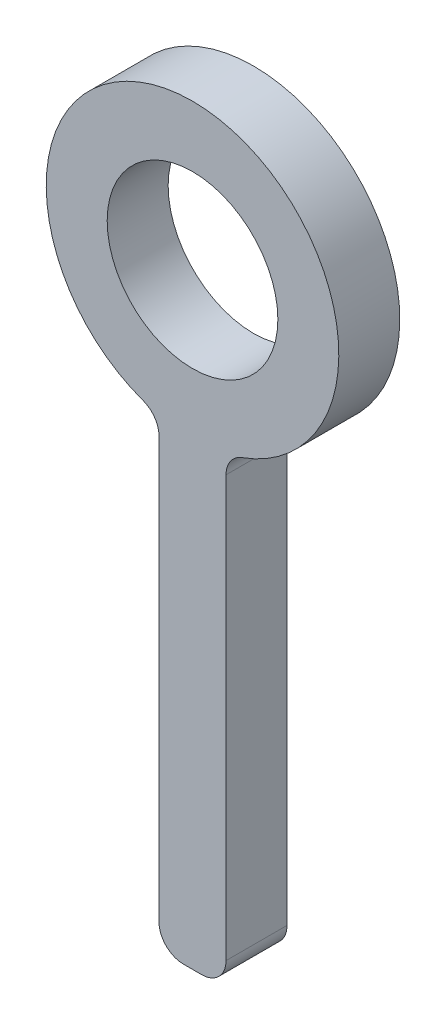
ISO-10303-21;
HEADER;
FILE_DESCRIPTION(('STEP AP214'),'2;1');
FILE_NAME('part.step','',(''),(''),'','','');
FILE_SCHEMA(('AUTOMOTIVE_DESIGN { 1 0 10303 214 1 1 1 1 }'));
ENDSEC;
DATA;
#1=APPLICATION_CONTEXT('core data for automotive mechanical design processes');
#2=APPLICATION_PROTOCOL_DEFINITION('international standard','automotive_design',2000,#1);
#3=PRODUCT_CONTEXT('',#1,'mechanical');
#4=PRODUCT('Part','Part','',(#3));
#5=PRODUCT_RELATED_PRODUCT_CATEGORY('part','',(#4));
#6=PRODUCT_DEFINITION_FORMATION('','',#4);
#7=PRODUCT_DEFINITION_CONTEXT('part definition',#1,'design');
#8=PRODUCT_DEFINITION('design','',#6,#7);
#9=PRODUCT_DEFINITION_SHAPE('','',#8);
#10=(LENGTH_UNIT() NAMED_UNIT(*) SI_UNIT(.MILLI.,.METRE.));
#11=(NAMED_UNIT(*) PLANE_ANGLE_UNIT() SI_UNIT($,.RADIAN.));
#12=(NAMED_UNIT(*) SI_UNIT($,.STERADIAN.) SOLID_ANGLE_UNIT());
#13=UNCERTAINTY_MEASURE_WITH_UNIT(LENGTH_MEASURE(1.E-05),#10,'distance_accuracy_value','');
#14=(GEOMETRIC_REPRESENTATION_CONTEXT(3) GLOBAL_UNCERTAINTY_ASSIGNED_CONTEXT((#13)) GLOBAL_UNIT_ASSIGNED_CONTEXT((#10,
#11,#12)) REPRESENTATION_CONTEXT('',''));
#15=CARTESIAN_POINT('',(0.,0.,0.));
#16=DIRECTION('',(0.,0.,1.));
#17=DIRECTION('',(1.,0.,0.));
#18=AXIS2_PLACEMENT_3D('',#15,#16,#17);
#19=CARTESIAN_POINT('',(2.75,11.6806463862237,5.));
#20=DIRECTION('',(0.,0.,-1.));
#21=DIRECTION('',(-1.,0.,0.));
#22=AXIS2_PLACEMENT_3D('',#19,#20,#21);
#23=PLANE('',#22);
#24=DIRECTION('',(1.,0.,0.));
#25=VECTOR('',#24,1.);
#26=CARTESIAN_POINT('',(0.,-38.,5.));
#27=LINE('',#26,#25);
#28=CARTESIAN_POINT('',(2.,-38.,5.));
#29=VERTEX_POINT('',#28);
#30=CARTESIAN_POINT('',(3.5,-38.,5.));
#31=VERTEX_POINT('',#30);
#32=EDGE_CURVE('E168',#29,#31,#27,.T.);
#33=ORIENTED_EDGE('',*,*,#32,.T.);
#34=CARTESIAN_POINT('',(3.5,-36.,5.));
#35=DIRECTION('',(0.,0.,-1.));
#36=DIRECTION('',(-1.,0.,0.));
#37=AXIS2_PLACEMENT_3D('',#34,#35,#36);
#38=CIRCLE('',#37,2.);
#39=CARTESIAN_POINT('',(5.5,-36.,5.));
#40=VERTEX_POINT('',#39);
#41=EDGE_CURVE('E140',#31,#40,#38,.F.);
#42=ORIENTED_EDGE('',*,*,#41,.T.);
#43=DIRECTION('',(0.,1.,0.));
#44=VECTOR('',#43,1.);
#45=CARTESIAN_POINT('',(5.5,-38.,5.));
#46=LINE('',#45,#44);
#47=CARTESIAN_POINT('',(5.5,-1.48892080484226,5.));
#48=VERTEX_POINT('',#47);
#49=EDGE_CURVE('E118',#40,#48,#46,.T.);
#50=ORIENTED_EDGE('',*,*,#49,.T.);
#51=CARTESIAN_POINT('',(7.50000000000001,-1.48892080484226,5.));
#52=DIRECTION('',(0.,0.,-1.));
#53=DIRECTION('',(-1.,0.,0.));
#54=AXIS2_PLACEMENT_3D('',#51,#52,#53);
#55=CIRCLE('',#54,2.);
#56=CARTESIAN_POINT('',(6.82142857142858,0.392445936738591,5.));
#57=VERTEX_POINT('',#56);
#58=EDGE_CURVE('E11',#48,#57,#55,.T.);
#59=ORIENTED_EDGE('',*,*,#58,.T.);
#60=CARTESIAN_POINT('',(2.75,11.6806463862237,5.));
#61=DIRECTION('',(0.,0.,1.));
#62=DIRECTION('',(-1.,0.,0.));
#63=AXIS2_PLACEMENT_3D('',#60,#61,#62);
#64=CIRCLE('',#63,12.);
#65=CARTESIAN_POINT('',(-1.32142857142857,0.392445936738591,5.));
#66=VERTEX_POINT('',#65);
#67=EDGE_CURVE('E124',#57,#66,#64,.T.);
#68=ORIENTED_EDGE('',*,*,#67,.T.);
#69=CARTESIAN_POINT('',(-2.,-1.48892080484226,5.));
#70=DIRECTION('',(0.,0.,-1.));
#71=DIRECTION('',(-1.,0.,0.));
#72=AXIS2_PLACEMENT_3D('',#69,#70,#71);
#73=CIRCLE('',#72,2.);
#74=CARTESIAN_POINT('',(0.,-1.48892080484226,5.));
#75=VERTEX_POINT('',#74);
#76=EDGE_CURVE('E54',#66,#75,#73,.T.);
#77=ORIENTED_EDGE('',*,*,#76,.T.);
#78=DIRECTION('',(0.,-1.,0.));
#79=VECTOR('',#78,1.);
#80=CARTESIAN_POINT('',(0.,0.,5.));
#81=LINE('',#80,#79);
#82=CARTESIAN_POINT('',(0.,-36.,5.));
#83=VERTEX_POINT('',#82);
#84=EDGE_CURVE('E127',#75,#83,#81,.T.);
#85=ORIENTED_EDGE('',*,*,#84,.T.);
#86=CARTESIAN_POINT('',(2.,-36.,5.));
#87=DIRECTION('',(0.,0.,-1.));
#88=DIRECTION('',(-1.,0.,0.));
#89=AXIS2_PLACEMENT_3D('',#86,#87,#88);
#90=CIRCLE('',#89,2.);
#91=EDGE_CURVE('E138',#83,#29,#90,.F.);
#92=ORIENTED_EDGE('',*,*,#91,.T.);
#93=EDGE_LOOP('',(#33,#42,#50,#59,#68,#77,#85,#92));
#94=FACE_BOUND('',#93,.T.);
#95=CARTESIAN_POINT('',(2.75,11.6806463862237,5.));
#96=DIRECTION('',(0.,0.,1.));
#97=DIRECTION('',(1.,0.,0.));
#98=AXIS2_PLACEMENT_3D('',#95,#96,#97);
#99=CIRCLE('',#98,7.);
#100=CARTESIAN_POINT('',(9.75,11.6806463862237,5.));
#101=VERTEX_POINT('',#100);
#102=EDGE_CURVE('E163',#101,#101,#99,.T.);
#103=ORIENTED_EDGE('',*,*,#102,.F.);
#104=EDGE_LOOP('',(#103));
#105=FACE_BOUND('',#104,.T.);
#106=ADVANCED_FACE('F32',(#94,#105),#23,.F.);
#107=CARTESIAN_POINT('',(2.75,11.6806463862237,0.));
#108=DIRECTION('',(0.,0.,-1.));
#109=DIRECTION('',(-1.,0.,0.));
#110=AXIS2_PLACEMENT_3D('',#107,#108,#109);
#111=PLANE('',#110);
#112=DIRECTION('',(0.,1.,0.));
#113=VECTOR('',#112,1.);
#114=CARTESIAN_POINT('',(5.5,-38.,0.));
#115=LINE('',#114,#113);
#116=CARTESIAN_POINT('',(5.5,-36.,0.));
#117=VERTEX_POINT('',#116);
#118=CARTESIAN_POINT('',(5.5,-1.48892080484226,0.));
#119=VERTEX_POINT('',#118);
#120=EDGE_CURVE('E115',#117,#119,#115,.T.);
#121=ORIENTED_EDGE('',*,*,#120,.F.);
#122=CARTESIAN_POINT('',(3.5,-36.,0.));
#123=DIRECTION('',(0.,0.,-1.));
#124=DIRECTION('',(-1.,0.,0.));
#125=AXIS2_PLACEMENT_3D('',#122,#123,#124);
#126=CIRCLE('',#125,2.);
#127=CARTESIAN_POINT('',(3.5,-38.,0.));
#128=VERTEX_POINT('',#127);
#129=EDGE_CURVE('E98',#117,#128,#126,.T.);
#130=ORIENTED_EDGE('',*,*,#129,.T.);
#131=DIRECTION('',(1.,0.,0.));
#132=VECTOR('',#131,1.);
#133=CARTESIAN_POINT('',(0.,-38.,0.));
#134=LINE('',#133,#132);
#135=CARTESIAN_POINT('',(2.,-38.,0.));
#136=VERTEX_POINT('',#135);
#137=EDGE_CURVE('E125',#136,#128,#134,.T.);
#138=ORIENTED_EDGE('',*,*,#137,.F.);
#139=CARTESIAN_POINT('',(2.,-36.,0.));
#140=DIRECTION('',(0.,0.,-1.));
#141=DIRECTION('',(-1.,0.,0.));
#142=AXIS2_PLACEMENT_3D('',#139,#140,#141);
#143=CIRCLE('',#142,2.);
#144=CARTESIAN_POINT('',(0.,-36.,0.));
#145=VERTEX_POINT('',#144);
#146=EDGE_CURVE('E109',#136,#145,#143,.T.);
#147=ORIENTED_EDGE('',*,*,#146,.T.);
#148=DIRECTION('',(0.,-1.,0.));
#149=VECTOR('',#148,1.);
#150=CARTESIAN_POINT('',(0.,0.,0.));
#151=LINE('',#150,#149);
#152=CARTESIAN_POINT('',(0.,-1.48892080484226,0.));
#153=VERTEX_POINT('',#152);
#154=EDGE_CURVE('E129',#153,#145,#151,.T.);
#155=ORIENTED_EDGE('',*,*,#154,.F.);
#156=CARTESIAN_POINT('',(-2.,-1.48892080484226,0.));
#157=DIRECTION('',(0.,0.,-1.));
#158=DIRECTION('',(-1.,0.,0.));
#159=AXIS2_PLACEMENT_3D('',#156,#157,#158);
#160=CIRCLE('',#159,2.);
#161=CARTESIAN_POINT('',(-1.32142857142857,0.392445936738591,0.));
#162=VERTEX_POINT('',#161);
#163=EDGE_CURVE('E151',#153,#162,#160,.F.);
#164=ORIENTED_EDGE('',*,*,#163,.T.);
#165=CARTESIAN_POINT('',(2.75,11.6806463862237,0.));
#166=DIRECTION('',(0.,0.,1.));
#167=DIRECTION('',(-1.,0.,0.));
#168=AXIS2_PLACEMENT_3D('',#165,#166,#167);
#169=CIRCLE('',#168,12.);
#170=CARTESIAN_POINT('',(6.82142857142858,0.392445936738591,0.));
#171=VERTEX_POINT('',#170);
#172=EDGE_CURVE('E155',#171,#162,#169,.T.);
#173=ORIENTED_EDGE('',*,*,#172,.F.);
#174=CARTESIAN_POINT('',(7.50000000000001,-1.48892080484226,0.));
#175=DIRECTION('',(0.,0.,-1.));
#176=DIRECTION('',(-1.,0.,0.));
#177=AXIS2_PLACEMENT_3D('',#174,#175,#176);
#178=CIRCLE('',#177,2.);
#179=EDGE_CURVE('E40',#171,#119,#178,.F.);
#180=ORIENTED_EDGE('',*,*,#179,.T.);
#181=EDGE_LOOP('',(#121,#130,#138,#147,#155,#164,#173,#180));
#182=FACE_BOUND('',#181,.T.);
#183=CARTESIAN_POINT('',(2.75,11.6806463862237,0.));
#184=DIRECTION('',(0.,0.,1.));
#185=DIRECTION('',(1.,0.,0.));
#186=AXIS2_PLACEMENT_3D('',#183,#184,#185);
#187=CIRCLE('',#186,7.);
#188=CARTESIAN_POINT('',(9.75,11.6806463862237,0.));
#189=VERTEX_POINT('',#188);
#190=EDGE_CURVE('E276',#189,#189,#187,.T.);
#191=ORIENTED_EDGE('',*,*,#190,.T.);
#192=EDGE_LOOP('',(#191));
#193=FACE_BOUND('',#192,.T.);
#194=ADVANCED_FACE('F121',(#182,#193),#111,.T.);
#195=CARTESIAN_POINT('',(2.75,11.6806463862237,5.));
#196=DIRECTION('',(0.,0.,-1.));
#197=DIRECTION('',(-1.,0.,0.));
#198=AXIS2_PLACEMENT_3D('',#195,#196,#197);
#199=CYLINDRICAL_SURFACE('',#198,12.);
#200=ORIENTED_EDGE('',*,*,#172,.T.);
#201=DIRECTION('',(0.,0.,-1.));
#202=VECTOR('',#201,1.);
#203=CARTESIAN_POINT('',(-1.32142857142857,0.392445936738588,5.));
#204=LINE('',#203,#202);
#205=EDGE_CURVE('E149',#162,#66,#204,.F.);
#206=ORIENTED_EDGE('',*,*,#205,.T.);
#207=ORIENTED_EDGE('',*,*,#67,.F.);
#208=DIRECTION('',(0.,0.,-1.));
#209=VECTOR('',#208,1.);
#210=CARTESIAN_POINT('',(6.82142857142858,0.392445936738588,5.));
#211=LINE('',#210,#209);
#212=EDGE_CURVE('E146',#57,#171,#211,.T.);
#213=ORIENTED_EDGE('',*,*,#212,.T.);
#214=EDGE_LOOP('',(#200,#206,#207,#213));
#215=FACE_BOUND('',#214,.T.);
#216=ADVANCED_FACE('F160',(#215),#199,.T.);
#217=CARTESIAN_POINT('',(0.,0.,5.));
#218=DIRECTION('',(1.,0.,0.));
#219=DIRECTION('',(0.,1.,0.));
#220=AXIS2_PLACEMENT_3D('',#217,#218,#219);
#221=PLANE('',#220);
#222=ORIENTED_EDGE('',*,*,#154,.T.);
#223=DIRECTION('',(0.,0.,-1.));
#224=VECTOR('',#223,1.);
#225=CARTESIAN_POINT('',(0.,-36.,5.));
#226=LINE('',#225,#224);
#227=EDGE_CURVE('E47',#145,#83,#226,.F.);
#228=ORIENTED_EDGE('',*,*,#227,.T.);
#229=ORIENTED_EDGE('',*,*,#84,.F.);
#230=DIRECTION('',(0.,0.,1.));
#231=VECTOR('',#230,1.);
#232=CARTESIAN_POINT('',(0.,-1.48892080484226,0.));
#233=LINE('',#232,#231);
#234=EDGE_CURVE('E142',#75,#153,#233,.F.);
#235=ORIENTED_EDGE('',*,*,#234,.T.);
#236=EDGE_LOOP('',(#222,#228,#229,#235));
#237=FACE_BOUND('',#236,.T.);
#238=ADVANCED_FACE('F166',(#237),#221,.F.);
#239=CARTESIAN_POINT('',(0.,-38.,5.));
#240=DIRECTION('',(0.,1.,0.));
#241=DIRECTION('',(0.,0.,1.));
#242=AXIS2_PLACEMENT_3D('',#239,#240,#241);
#243=PLANE('',#242);
#244=ORIENTED_EDGE('',*,*,#137,.T.);
#245=DIRECTION('',(0.,0.,-1.));
#246=VECTOR('',#245,1.);
#247=CARTESIAN_POINT('',(3.5,-38.,5.));
#248=LINE('',#247,#246);
#249=EDGE_CURVE('E103',#128,#31,#248,.F.);
#250=ORIENTED_EDGE('',*,*,#249,.T.);
#251=ORIENTED_EDGE('',*,*,#32,.F.);
#252=DIRECTION('',(0.,0.,-1.));
#253=VECTOR('',#252,1.);
#254=CARTESIAN_POINT('',(2.,-38.,5.));
#255=LINE('',#254,#253);
#256=EDGE_CURVE('E108',#29,#136,#255,.T.);
#257=ORIENTED_EDGE('',*,*,#256,.T.);
#258=EDGE_LOOP('',(#244,#250,#251,#257));
#259=FACE_BOUND('',#258,.T.);
#260=ADVANCED_FACE('F193',(#259),#243,.F.);
#261=CARTESIAN_POINT('',(5.5,-38.,5.));
#262=DIRECTION('',(-1.,0.,0.));
#263=DIRECTION('',(0.,0.,1.));
#264=AXIS2_PLACEMENT_3D('',#261,#262,#263);
#265=PLANE('',#264);
#266=ORIENTED_EDGE('',*,*,#49,.F.);
#267=DIRECTION('',(0.,0.,-1.));
#268=VECTOR('',#267,1.);
#269=CARTESIAN_POINT('',(5.5,-36.,5.));
#270=LINE('',#269,#268);
#271=EDGE_CURVE('E102',#40,#117,#270,.T.);
#272=ORIENTED_EDGE('',*,*,#271,.T.);
#273=ORIENTED_EDGE('',*,*,#120,.T.);
#274=DIRECTION('',(0.,0.,1.));
#275=VECTOR('',#274,1.);
#276=CARTESIAN_POINT('',(5.5,-1.48892080484226,5.));
#277=LINE('',#276,#275);
#278=EDGE_CURVE('E119',#119,#48,#277,.T.);
#279=ORIENTED_EDGE('',*,*,#278,.T.);
#280=EDGE_LOOP('',(#266,#272,#273,#279));
#281=FACE_BOUND('',#280,.T.);
#282=ADVANCED_FACE('F114',(#281),#265,.F.);
#283=CARTESIAN_POINT('',(2.75,11.6806463862237,5.));
#284=DIRECTION('',(0.,0.,-1.));
#285=DIRECTION('',(-1.,0.,0.));
#286=AXIS2_PLACEMENT_3D('',#283,#284,#285);
#287=CYLINDRICAL_SURFACE('',#286,7.);
#288=ORIENTED_EDGE('',*,*,#102,.T.);
#289=EDGE_LOOP('',(#288));
#290=FACE_BOUND('',#289,.T.);
#291=ORIENTED_EDGE('',*,*,#190,.F.);
#292=EDGE_LOOP('',(#291));
#293=FACE_BOUND('',#292,.T.);
#294=ADVANCED_FACE('F189',(#290,#293),#287,.F.);
#295=CARTESIAN_POINT('',(3.5,-36.,5.));
#296=DIRECTION('',(0.,0.,-1.));
#297=DIRECTION('',(-1.,0.,0.));
#298=AXIS2_PLACEMENT_3D('',#295,#296,#297);
#299=CYLINDRICAL_SURFACE('',#298,2.);
#300=ORIENTED_EDGE('',*,*,#41,.F.);
#301=ORIENTED_EDGE('',*,*,#249,.F.);
#302=ORIENTED_EDGE('',*,*,#129,.F.);
#303=ORIENTED_EDGE('',*,*,#271,.F.);
#304=EDGE_LOOP('',(#300,#301,#302,#303));
#305=FACE_BOUND('',#304,.T.);
#306=ADVANCED_FACE('F101',(#305),#299,.T.);
#307=CARTESIAN_POINT('',(2.,-36.,5.));
#308=DIRECTION('',(0.,0.,-1.));
#309=DIRECTION('',(-1.,0.,0.));
#310=AXIS2_PLACEMENT_3D('',#307,#308,#309);
#311=CYLINDRICAL_SURFACE('',#310,2.);
#312=ORIENTED_EDGE('',*,*,#91,.F.);
#313=ORIENTED_EDGE('',*,*,#227,.F.);
#314=ORIENTED_EDGE('',*,*,#146,.F.);
#315=ORIENTED_EDGE('',*,*,#256,.F.);
#316=EDGE_LOOP('',(#312,#313,#314,#315));
#317=FACE_BOUND('',#316,.T.);
#318=ADVANCED_FACE('F181',(#317),#311,.T.);
#319=CARTESIAN_POINT('',(-2.,-1.48892080484226,5.));
#320=DIRECTION('',(0.,0.,-1.));
#321=DIRECTION('',(-1.,0.,0.));
#322=AXIS2_PLACEMENT_3D('',#319,#320,#321);
#323=CYLINDRICAL_SURFACE('',#322,2.);
#324=ORIENTED_EDGE('',*,*,#76,.F.);
#325=ORIENTED_EDGE('',*,*,#205,.F.);
#326=ORIENTED_EDGE('',*,*,#163,.F.);
#327=ORIENTED_EDGE('',*,*,#234,.F.);
#328=EDGE_LOOP('',(#324,#325,#326,#327));
#329=FACE_BOUND('',#328,.T.);
#330=ADVANCED_FACE('F165',(#329),#323,.F.);
#331=CARTESIAN_POINT('',(7.50000000000001,-1.48892080484226,5.));
#332=DIRECTION('',(0.,0.,-1.));
#333=DIRECTION('',(-1.,0.,0.));
#334=AXIS2_PLACEMENT_3D('',#331,#332,#333);
#335=CYLINDRICAL_SURFACE('',#334,2.);
#336=ORIENTED_EDGE('',*,*,#58,.F.);
#337=ORIENTED_EDGE('',*,*,#278,.F.);
#338=ORIENTED_EDGE('',*,*,#179,.F.);
#339=ORIENTED_EDGE('',*,*,#212,.F.);
#340=EDGE_LOOP('',(#336,#337,#338,#339));
#341=FACE_BOUND('',#340,.T.);
#342=ADVANCED_FACE('F34',(#341),#335,.F.);
#343=CLOSED_SHELL('',(#106,#194,#216,#238,#260,#282,#294,#306,#318,#330,#342));
#344=MANIFOLD_SOLID_BREP('B2',#343);
#345=ADVANCED_BREP_SHAPE_REPRESENTATION('',(#18,#344),#14);
#346=SHAPE_DEFINITION_REPRESENTATION(#9,#345);
ENDSEC;
END-ISO-10303-21;
